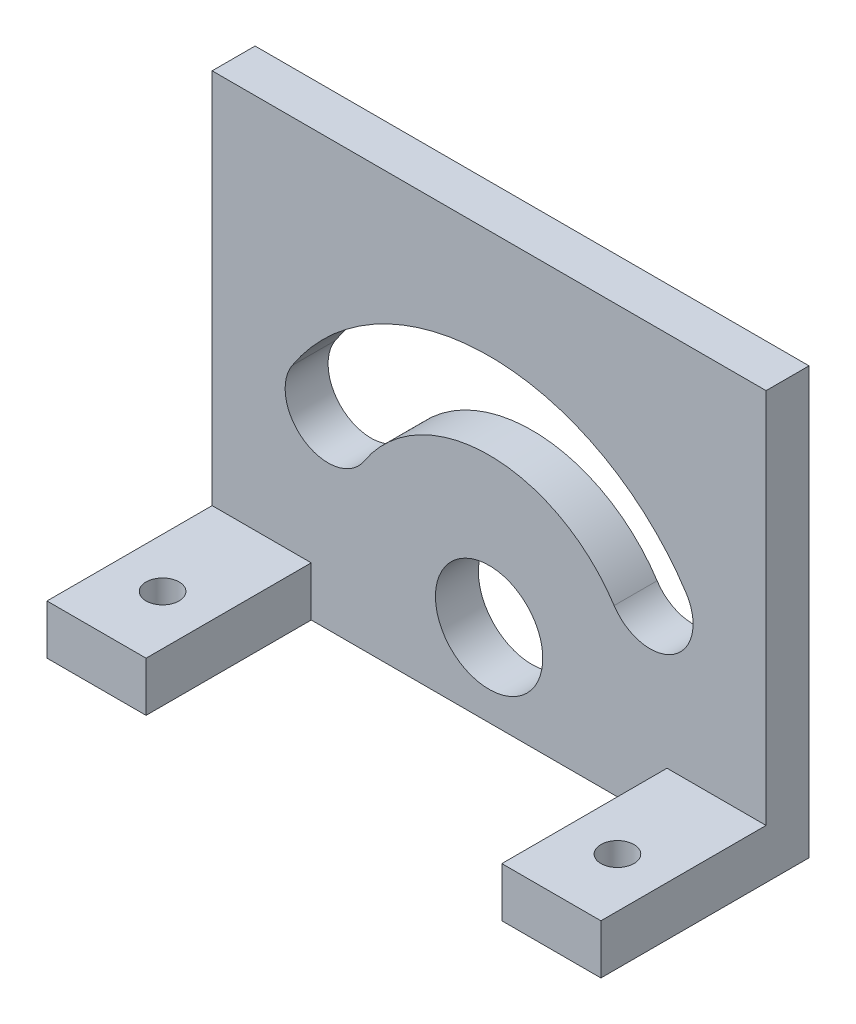
ISO-10303-21;
HEADER;
FILE_DESCRIPTION(('STEP AP214'),'2;1');
FILE_NAME('part.step','',(''),(''),'','','');
FILE_SCHEMA(('AUTOMOTIVE_DESIGN { 1 0 10303 214 1 1 1 1 }'));
ENDSEC;
DATA;
#1=APPLICATION_CONTEXT('core data for automotive mechanical design processes');
#2=APPLICATION_PROTOCOL_DEFINITION('international standard','automotive_design',2000,#1);
#3=PRODUCT_CONTEXT('',#1,'mechanical');
#4=PRODUCT('Part','Part','',(#3));
#5=PRODUCT_RELATED_PRODUCT_CATEGORY('part','',(#4));
#6=PRODUCT_DEFINITION_FORMATION('','',#4);
#7=PRODUCT_DEFINITION_CONTEXT('part definition',#1,'design');
#8=PRODUCT_DEFINITION('design','',#6,#7);
#9=PRODUCT_DEFINITION_SHAPE('','',#8);
#10=(LENGTH_UNIT() NAMED_UNIT(*) SI_UNIT(.MILLI.,.METRE.));
#11=(NAMED_UNIT(*) PLANE_ANGLE_UNIT() SI_UNIT($,.RADIAN.));
#12=(NAMED_UNIT(*) SI_UNIT($,.STERADIAN.) SOLID_ANGLE_UNIT());
#13=UNCERTAINTY_MEASURE_WITH_UNIT(LENGTH_MEASURE(1.E-05),#10,'distance_accuracy_value','');
#14=(GEOMETRIC_REPRESENTATION_CONTEXT(3) GLOBAL_UNCERTAINTY_ASSIGNED_CONTEXT((#13)) GLOBAL_UNIT_ASSIGNED_CONTEXT((#10,
#11,#12)) REPRESENTATION_CONTEXT('',''));
#15=CARTESIAN_POINT('',(0.,0.,0.));
#16=DIRECTION('',(0.,0.,1.));
#17=DIRECTION('',(1.,0.,0.));
#18=AXIS2_PLACEMENT_3D('',#15,#16,#17);
#19=CARTESIAN_POINT('',(-48.2570233696967,36.6757535053965,3.75));
#20=DIRECTION('',(0.,0.,1.));
#21=DIRECTION('',(1.,0.,0.));
#22=AXIS2_PLACEMENT_3D('',#19,#20,#21);
#23=PLANE('',#22);
#24=DIRECTION('',(0.,-1.,0.));
#25=VECTOR('',#24,1.);
#26=CARTESIAN_POINT('',(51.7929766303033,-20.3242464946035,3.75));
#27=LINE('',#26,#25);
#28=CARTESIAN_POINT('',(51.7929766303033,-20.3242464946035,3.75));
#29=VERTEX_POINT('',#28);
#30=CARTESIAN_POINT('',(51.7929766303033,-27.8242464946035,3.75000000000001));
#31=VERTEX_POINT('',#30);
#32=EDGE_CURVE('E50',#29,#31,#27,.T.);
#33=ORIENTED_EDGE('',*,*,#32,.F.);
#34=DIRECTION('',(1.,0.,0.));
#35=VECTOR('',#34,1.);
#36=CARTESIAN_POINT('',(66.7929766303033,-20.3242464946035,3.75000000000001));
#37=LINE('',#36,#35);
#38=CARTESIAN_POINT('',(66.7929766303033,-20.3242464946035,3.75));
#39=VERTEX_POINT('',#38);
#40=EDGE_CURVE('E55',#29,#39,#37,.T.);
#41=ORIENTED_EDGE('',*,*,#40,.T.);
#42=DIRECTION('',(0.,1.,0.));
#43=VECTOR('',#42,1.);
#44=CARTESIAN_POINT('',(66.7929766303033,36.6757535053965,3.75));
#45=LINE('',#44,#43);
#46=CARTESIAN_POINT('',(66.7929766303033,36.6757535053965,3.75));
#47=VERTEX_POINT('',#46);
#48=EDGE_CURVE('E155',#39,#47,#45,.T.);
#49=ORIENTED_EDGE('',*,*,#48,.T.);
#50=DIRECTION('',(-1.,0.,0.));
#51=VECTOR('',#50,1.);
#52=CARTESIAN_POINT('',(37.7054766303033,36.6757535053965,3.75));
#53=LINE('',#52,#51);
#54=CARTESIAN_POINT('',(-17.0570233696967,36.6757535053965,3.75000000000001));
#55=VERTEX_POINT('',#54);
#56=EDGE_CURVE('E245',#47,#55,#53,.T.);
#57=ORIENTED_EDGE('',*,*,#56,.T.);
#58=DIRECTION('',(0.,-1.,0.));
#59=VECTOR('',#58,1.);
#60=CARTESIAN_POINT('',(-17.0570233696967,36.6757535053965,3.75000000000001));
#61=LINE('',#60,#59);
#62=CARTESIAN_POINT('',(-17.0570233696967,-20.3242464946035,3.75000000000001));
#63=VERTEX_POINT('',#62);
#64=EDGE_CURVE('E192',#55,#63,#61,.T.);
#65=ORIENTED_EDGE('',*,*,#64,.T.);
#66=DIRECTION('',(1.,0.,0.));
#67=VECTOR('',#66,1.);
#68=CARTESIAN_POINT('',(-17.0570233696967,-20.3242464946035,3.75000000000001));
#69=LINE('',#68,#67);
#70=CARTESIAN_POINT('',(-2.05702336969668,-20.3242464946035,3.75000000000001));
#71=VERTEX_POINT('',#70);
#72=EDGE_CURVE('E174',#63,#71,#69,.T.);
#73=ORIENTED_EDGE('',*,*,#72,.T.);
#74=DIRECTION('',(0.,-1.,0.));
#75=VECTOR('',#74,1.);
#76=CARTESIAN_POINT('',(-2.05702336969668,-20.3242464946035,3.75000000000001));
#77=LINE('',#76,#75);
#78=CARTESIAN_POINT('',(-2.05702336969668,-27.8242464946035,3.75000000000001));
#79=VERTEX_POINT('',#78);
#80=EDGE_CURVE('E184',#71,#79,#77,.T.);
#81=ORIENTED_EDGE('',*,*,#80,.T.);
#82=DIRECTION('',(1.,0.,0.));
#83=VECTOR('',#82,1.);
#84=CARTESIAN_POINT('',(66.7929766303033,-27.8242464946035,3.75000000000001));
#85=LINE('',#84,#83);
#86=EDGE_CURVE('E199',#79,#31,#85,.T.);
#87=ORIENTED_EDGE('',*,*,#86,.T.);
#88=EDGE_LOOP('',(#33,#41,#49,#57,#65,#73,#81,#87));
#89=FACE_BOUND('',#88,.T.);
#90=CARTESIAN_POINT('',(49.2429766303033,0.548435422766312,3.75));
#91=DIRECTION('',(0.,0.,1.));
#92=DIRECTION('',(1.,0.,0.));
#93=AXIS2_PLACEMENT_3D('',#90,#91,#92);
#94=CIRCLE('',#93,6.50000000000001);
#95=CARTESIAN_POINT('',(43.7960492560016,-2.99853260346159,3.75000000000001));
#96=VERTEX_POINT('',#95);
#97=CARTESIAN_POINT('',(54.689904004605,4.09540344899422,3.75000000000001));
#98=VERTEX_POINT('',#97);
#99=EDGE_CURVE('E235',#96,#98,#94,.T.);
#100=ORIENTED_EDGE('',*,*,#99,.F.);
#101=CARTESIAN_POINT('',(24.8679766303033,-15.3242464946035,3.75));
#102=DIRECTION('',(0.,0.,1.));
#103=DIRECTION('',(1.,0.,0.));
#104=AXIS2_PLACEMENT_3D('',#101,#102,#103);
#105=CIRCLE('',#104,22.5875);
#106=CARTESIAN_POINT('',(5.93990400460499,-2.99853260346159,3.75));
#107=VERTEX_POINT('',#106);
#108=EDGE_CURVE('E222',#107,#96,#105,.F.);
#109=ORIENTED_EDGE('',*,*,#108,.F.);
#110=CARTESIAN_POINT('',(0.492976630303313,0.548435422766312,3.75));
#111=DIRECTION('',(0.,0.,1.));
#112=DIRECTION('',(1.,0.,0.));
#113=AXIS2_PLACEMENT_3D('',#110,#111,#112);
#114=CIRCLE('',#113,6.5);
#115=CARTESIAN_POINT('',(-4.95395074399836,4.09540344899421,3.75000000000001));
#116=VERTEX_POINT('',#115);
#117=EDGE_CURVE('E230',#116,#107,#114,.T.);
#118=ORIENTED_EDGE('',*,*,#117,.F.);
#119=CARTESIAN_POINT('',(24.8679766303033,-15.3242464946035,3.75));
#120=DIRECTION('',(0.,0.,1.));
#121=DIRECTION('',(1.,0.,0.));
#122=AXIS2_PLACEMENT_3D('',#119,#120,#121);
#123=CIRCLE('',#122,35.5875);
#124=EDGE_CURVE('E233',#98,#116,#123,.T.);
#125=ORIENTED_EDGE('',*,*,#124,.F.);
#126=EDGE_LOOP('',(#100,#109,#118,#125));
#127=FACE_BOUND('',#126,.T.);
#128=CARTESIAN_POINT('',(24.8679766303033,-15.3242464946035,3.75));
#129=DIRECTION('',(0.,0.,1.));
#130=DIRECTION('',(1.,0.,0.));
#131=AXIS2_PLACEMENT_3D('',#128,#129,#130);
#132=CIRCLE('',#131,8.125);
#133=CARTESIAN_POINT('',(16.7429766303033,-15.3242464946035,3.75));
#134=VERTEX_POINT('',#133);
#135=EDGE_CURVE('E240',#134,#134,#132,.T.);
#136=ORIENTED_EDGE('',*,*,#135,.F.);
#137=EDGE_LOOP('',(#136));
#138=FACE_BOUND('',#137,.T.);
#139=ADVANCED_FACE('F35',(#89,#127,#138),#23,.T.);
#140=CARTESIAN_POINT('',(66.7929766303033,36.6757535053965,3.75));
#141=DIRECTION('',(-1.,0.,0.));
#142=DIRECTION('',(0.,0.,1.));
#143=AXIS2_PLACEMENT_3D('',#140,#141,#142);
#144=PLANE('',#143);
#145=ORIENTED_EDGE('',*,*,#48,.F.);
#146=DIRECTION('',(0.,0.,1.));
#147=VECTOR('',#146,1.);
#148=CARTESIAN_POINT('',(66.7929766303033,-20.3242464946035,3.75000000000001));
#149=LINE('',#148,#147);
#150=CARTESIAN_POINT('',(66.7929766303033,-20.3242464946035,28.75));
#151=VERTEX_POINT('',#150);
#152=EDGE_CURVE('E151',#39,#151,#149,.T.);
#153=ORIENTED_EDGE('',*,*,#152,.T.);
#154=DIRECTION('',(0.,-1.,0.));
#155=VECTOR('',#154,1.);
#156=CARTESIAN_POINT('',(66.7929766303033,-20.3242464946035,28.75));
#157=LINE('',#156,#155);
#158=CARTESIAN_POINT('',(66.7929766303033,-27.8242464946035,28.75));
#159=VERTEX_POINT('',#158);
#160=EDGE_CURVE('E136',#151,#159,#157,.T.);
#161=ORIENTED_EDGE('',*,*,#160,.T.);
#162=DIRECTION('',(0.,0.,-1.));
#163=VECTOR('',#162,1.);
#164=CARTESIAN_POINT('',(66.7929766303033,-27.8242464946035,3.75000000000001));
#165=LINE('',#164,#163);
#166=CARTESIAN_POINT('',(66.7929766303033,-27.8242464946035,-2.75));
#167=VERTEX_POINT('',#166);
#168=EDGE_CURVE('E202',#159,#167,#165,.T.);
#169=ORIENTED_EDGE('',*,*,#168,.T.);
#170=DIRECTION('',(0.,1.,0.));
#171=VECTOR('',#170,1.);
#172=CARTESIAN_POINT('',(66.7929766303033,36.6757535053965,-2.75));
#173=LINE('',#172,#171);
#174=CARTESIAN_POINT('',(66.7929766303033,36.6757535053965,-2.75));
#175=VERTEX_POINT('',#174);
#176=EDGE_CURVE('E243',#167,#175,#173,.T.);
#177=ORIENTED_EDGE('',*,*,#176,.T.);
#178=DIRECTION('',(0.,0.,-1.));
#179=VECTOR('',#178,1.);
#180=CARTESIAN_POINT('',(66.7929766303033,36.6757535053965,3.75));
#181=LINE('',#180,#179);
#182=EDGE_CURVE('E249',#47,#175,#181,.T.);
#183=ORIENTED_EDGE('',*,*,#182,.F.);
#184=EDGE_LOOP('',(#145,#153,#161,#169,#177,#183));
#185=FACE_BOUND('',#184,.T.);
#186=ADVANCED_FACE('F37',(#185),#144,.F.);
#187=CARTESIAN_POINT('',(-48.2570233696967,36.6757535053965,3.75));
#188=DIRECTION('',(0.,-1.,0.));
#189=DIRECTION('',(0.,0.,-1.));
#190=AXIS2_PLACEMENT_3D('',#187,#188,#189);
#191=PLANE('',#190);
#192=DIRECTION('',(-1.,0.,0.));
#193=VECTOR('',#192,1.);
#194=CARTESIAN_POINT('',(-48.2570233696967,36.6757535053965,-2.75));
#195=LINE('',#194,#193);
#196=CARTESIAN_POINT('',(-17.0570233696967,36.6757535053965,-2.75));
#197=VERTEX_POINT('',#196);
#198=EDGE_CURVE('E246',#175,#197,#195,.T.);
#199=ORIENTED_EDGE('',*,*,#198,.T.);
#200=DIRECTION('',(0.,0.,-1.));
#201=VECTOR('',#200,1.);
#202=CARTESIAN_POINT('',(-17.0570233696967,36.6757535053965,3.75000000000001));
#203=LINE('',#202,#201);
#204=EDGE_CURVE('E201',#55,#197,#203,.T.);
#205=ORIENTED_EDGE('',*,*,#204,.F.);
#206=ORIENTED_EDGE('',*,*,#56,.F.);
#207=ORIENTED_EDGE('',*,*,#182,.T.);
#208=EDGE_LOOP('',(#199,#205,#206,#207));
#209=FACE_BOUND('',#208,.T.);
#210=ADVANCED_FACE('F262',(#209),#191,.F.);
#211=CARTESIAN_POINT('',(-48.2570233696967,36.6757535053965,-2.75));
#212=DIRECTION('',(0.,0.,1.));
#213=DIRECTION('',(1.,0.,0.));
#214=AXIS2_PLACEMENT_3D('',#211,#212,#213);
#215=PLANE('',#214);
#216=CARTESIAN_POINT('',(24.8679766303033,-15.3242464946035,-2.75));
#217=DIRECTION('',(0.,0.,1.));
#218=DIRECTION('',(-1.,0.,0.));
#219=AXIS2_PLACEMENT_3D('',#216,#217,#218);
#220=CIRCLE('',#219,22.5875);
#221=CARTESIAN_POINT('',(43.7960492560016,-2.99853260346159,-2.75));
#222=VERTEX_POINT('',#221);
#223=CARTESIAN_POINT('',(5.93990400460499,-2.99853260346159,-2.75));
#224=VERTEX_POINT('',#223);
#225=EDGE_CURVE('E210',#222,#224,#220,.T.);
#226=ORIENTED_EDGE('',*,*,#225,.F.);
#227=CARTESIAN_POINT('',(49.2429766303033,0.548435422766312,-2.75));
#228=DIRECTION('',(0.,0.,-1.));
#229=DIRECTION('',(-1.,0.,0.));
#230=AXIS2_PLACEMENT_3D('',#227,#228,#229);
#231=CIRCLE('',#230,6.50000000000001);
#232=CARTESIAN_POINT('',(54.689904004605,4.09540344899422,-2.75));
#233=VERTEX_POINT('',#232);
#234=EDGE_CURVE('E204',#233,#222,#231,.T.);
#235=ORIENTED_EDGE('',*,*,#234,.F.);
#236=CARTESIAN_POINT('',(24.8679766303033,-15.3242464946035,-2.75));
#237=DIRECTION('',(0.,0.,-1.));
#238=DIRECTION('',(-1.,0.,0.));
#239=AXIS2_PLACEMENT_3D('',#236,#237,#238);
#240=CIRCLE('',#239,35.5875);
#241=CARTESIAN_POINT('',(-4.95395074399836,4.09540344899421,-2.75));
#242=VERTEX_POINT('',#241);
#243=EDGE_CURVE('E216',#242,#233,#240,.T.);
#244=ORIENTED_EDGE('',*,*,#243,.F.);
#245=CARTESIAN_POINT('',(0.492976630303313,0.548435422766312,-2.75));
#246=DIRECTION('',(0.,0.,-1.));
#247=DIRECTION('',(-1.,0.,0.));
#248=AXIS2_PLACEMENT_3D('',#245,#246,#247);
#249=CIRCLE('',#248,6.5);
#250=EDGE_CURVE('E213',#224,#242,#249,.T.);
#251=ORIENTED_EDGE('',*,*,#250,.F.);
#252=EDGE_LOOP('',(#226,#235,#244,#251));
#253=FACE_BOUND('',#252,.T.);
#254=CARTESIAN_POINT('',(24.8679766303033,-15.3242464946035,-2.75));
#255=DIRECTION('',(0.,0.,-1.));
#256=DIRECTION('',(-1.,0.,0.));
#257=AXIS2_PLACEMENT_3D('',#254,#255,#256);
#258=CIRCLE('',#257,8.125);
#259=CARTESIAN_POINT('',(16.7429766303033,-15.3242464946035,-2.75));
#260=VERTEX_POINT('',#259);
#261=EDGE_CURVE('E237',#260,#260,#258,.T.);
#262=ORIENTED_EDGE('',*,*,#261,.F.);
#263=EDGE_LOOP('',(#262));
#264=FACE_BOUND('',#263,.T.);
#265=ORIENTED_EDGE('',*,*,#176,.F.);
#266=DIRECTION('',(-1.,0.,0.));
#267=VECTOR('',#266,1.);
#268=CARTESIAN_POINT('',(-48.2570233696967,-27.8242464946035,-2.75));
#269=LINE('',#268,#267);
#270=CARTESIAN_POINT('',(-17.0570233696967,-27.8242464946035,-2.75));
#271=VERTEX_POINT('',#270);
#272=EDGE_CURVE('E11',#167,#271,#269,.T.);
#273=ORIENTED_EDGE('',*,*,#272,.T.);
#274=DIRECTION('',(0.,1.,0.));
#275=VECTOR('',#274,1.);
#276=CARTESIAN_POINT('',(-17.0570233696967,36.6757535053965,-2.75));
#277=LINE('',#276,#275);
#278=EDGE_CURVE('E43',#271,#197,#277,.T.);
#279=ORIENTED_EDGE('',*,*,#278,.T.);
#280=ORIENTED_EDGE('',*,*,#198,.F.);
#281=EDGE_LOOP('',(#265,#273,#279,#280));
#282=FACE_BOUND('',#281,.T.);
#283=ADVANCED_FACE('F258',(#253,#264,#282),#215,.F.);
#284=CARTESIAN_POINT('',(24.8679766303033,-15.3242464946035,19.675));
#285=DIRECTION('',(0.,0.,-1.));
#286=DIRECTION('',(-1.,0.,0.));
#287=AXIS2_PLACEMENT_3D('',#284,#285,#286);
#288=CYLINDRICAL_SURFACE('',#287,8.125);
#289=CARTESIAN_POINT('',(16.7429766303033,-15.3242464946035,3.75));
#290=CARTESIAN_POINT('',(16.7429766303033,-15.3242464946035,3.68229166666667));
#291=CARTESIAN_POINT('',(16.7429766303033,-15.3242464946035,3.61458333333334));
#292=CARTESIAN_POINT('',(16.7429766303033,-15.3242464946035,3.47916666666667));
#293=CARTESIAN_POINT('',(16.7429766303033,-15.3242464946035,3.41145833333334));
#294=CARTESIAN_POINT('',(16.7429766303033,-15.3242464946035,3.27604166666667));
#295=CARTESIAN_POINT('',(16.7429766303033,-15.3242464946035,3.20833333333334));
#296=CARTESIAN_POINT('',(16.7429766303033,-15.3242464946035,3.07291666666667));
#297=CARTESIAN_POINT('',(16.7429766303033,-15.3242464946035,3.00520833333334));
#298=CARTESIAN_POINT('',(16.7429766303033,-15.3242464946035,2.86979166666667));
#299=CARTESIAN_POINT('',(16.7429766303033,-15.3242464946035,2.80208333333334));
#300=CARTESIAN_POINT('',(16.7429766303033,-15.3242464946035,2.66666666666667));
#301=CARTESIAN_POINT('',(16.7429766303033,-15.3242464946035,2.59895833333334));
#302=CARTESIAN_POINT('',(16.7429766303033,-15.3242464946035,2.46354166666667));
#303=CARTESIAN_POINT('',(16.7429766303033,-15.3242464946035,2.39583333333333));
#304=CARTESIAN_POINT('',(16.7429766303033,-15.3242464946035,2.26041666666667));
#305=CARTESIAN_POINT('',(16.7429766303033,-15.3242464946035,2.19270833333333));
#306=CARTESIAN_POINT('',(16.7429766303033,-15.3242464946035,2.05729166666667));
#307=CARTESIAN_POINT('',(16.7429766303033,-15.3242464946035,1.98958333333334));
#308=CARTESIAN_POINT('',(16.7429766303033,-15.3242464946035,1.85416666666667));
#309=CARTESIAN_POINT('',(16.7429766303033,-15.3242464946035,1.78645833333334));
#310=CARTESIAN_POINT('',(16.7429766303033,-15.3242464946035,1.65104166666667));
#311=CARTESIAN_POINT('',(16.7429766303033,-15.3242464946035,1.58333333333333));
#312=CARTESIAN_POINT('',(16.7429766303033,-15.3242464946035,1.44791666666667));
#313=CARTESIAN_POINT('',(16.7429766303033,-15.3242464946035,1.38020833333333));
#314=CARTESIAN_POINT('',(16.7429766303033,-15.3242464946035,1.24479166666667));
#315=CARTESIAN_POINT('',(16.7429766303033,-15.3242464946035,1.17708333333334));
#316=CARTESIAN_POINT('',(16.7429766303033,-15.3242464946035,1.04166666666667));
#317=CARTESIAN_POINT('',(16.7429766303033,-15.3242464946035,0.973958333333335));
#318=CARTESIAN_POINT('',(16.7429766303033,-15.3242464946035,0.838541666666667));
#319=CARTESIAN_POINT('',(16.7429766303033,-15.3242464946035,0.770833333333333));
#320=CARTESIAN_POINT('',(16.7429766303033,-15.3242464946035,0.635416666666666));
#321=CARTESIAN_POINT('',(16.7429766303033,-15.3242464946035,0.567708333333333));
#322=CARTESIAN_POINT('',(16.7429766303033,-15.3242464946035,0.432291666666668));
#323=CARTESIAN_POINT('',(16.7429766303033,-15.3242464946035,0.364583333333335));
#324=CARTESIAN_POINT('',(16.7429766303033,-15.3242464946035,0.229166666666668));
#325=CARTESIAN_POINT('',(16.7429766303033,-15.3242464946035,0.161458333333334));
#326=CARTESIAN_POINT('',(16.7429766303033,-15.3242464946035,0.0260416666666661));
#327=CARTESIAN_POINT('',(16.7429766303033,-15.3242464946035,-0.0416666666666679));
#328=CARTESIAN_POINT('',(16.7429766303033,-15.3242464946035,-0.177083333333335));
#329=CARTESIAN_POINT('',(16.7429766303033,-15.3242464946035,-0.244791666666667));
#330=CARTESIAN_POINT('',(16.7429766303033,-15.3242464946035,-0.380208333333333));
#331=CARTESIAN_POINT('',(16.7429766303033,-15.3242464946035,-0.447916666666666));
#332=CARTESIAN_POINT('',(16.7429766303033,-15.3242464946035,-0.583333333333333));
#333=CARTESIAN_POINT('',(16.7429766303033,-15.3242464946035,-0.651041666666667));
#334=CARTESIAN_POINT('',(16.7429766303033,-15.3242464946035,-0.786458333333335));
#335=CARTESIAN_POINT('',(16.7429766303033,-15.3242464946035,-0.854166666666669));
#336=CARTESIAN_POINT('',(16.7429766303033,-15.3242464946035,-0.989583333333335));
#337=CARTESIAN_POINT('',(16.7429766303033,-15.3242464946035,-1.05729166666667));
#338=CARTESIAN_POINT('',(16.7429766303033,-15.3242464946035,-1.19270833333333));
#339=CARTESIAN_POINT('',(16.7429766303033,-15.3242464946035,-1.26041666666667));
#340=CARTESIAN_POINT('',(16.7429766303033,-15.3242464946035,-1.39583333333333));
#341=CARTESIAN_POINT('',(16.7429766303033,-15.3242464946035,-1.46354166666667));
#342=CARTESIAN_POINT('',(16.7429766303033,-15.3242464946035,-1.59895833333334));
#343=CARTESIAN_POINT('',(16.7429766303033,-15.3242464946035,-1.66666666666667));
#344=CARTESIAN_POINT('',(16.7429766303033,-15.3242464946035,-1.80208333333334));
#345=CARTESIAN_POINT('',(16.7429766303033,-15.3242464946035,-1.86979166666667));
#346=CARTESIAN_POINT('',(16.7429766303033,-15.3242464946035,-2.00520833333333));
#347=CARTESIAN_POINT('',(16.7429766303033,-15.3242464946035,-2.07291666666667));
#348=CARTESIAN_POINT('',(16.7429766303033,-15.3242464946035,-2.20833333333333));
#349=CARTESIAN_POINT('',(16.7429766303033,-15.3242464946035,-2.27604166666667));
#350=CARTESIAN_POINT('',(16.7429766303033,-15.3242464946035,-2.41145833333334));
#351=CARTESIAN_POINT('',(16.7429766303033,-15.3242464946035,-2.47916666666667));
#352=CARTESIAN_POINT('',(16.7429766303033,-15.3242464946035,-2.61458333333334));
#353=CARTESIAN_POINT('',(16.7429766303033,-15.3242464946035,-2.68229166666667));
#354=CARTESIAN_POINT('',(16.7429766303033,-15.3242464946035,-2.75));
#355=B_SPLINE_CURVE_WITH_KNOTS('',3,(#289,#290,#291,#292,#293,#294,#295,#296,#297,#298,#299,
#300,#301,#302,#303,#304,#305,#306,#307,#308,#309,#310,#311,#312,#313,#314,#315,#316,#317,#318,
#319,#320,#321,#322,#323,#324,#325,#326,#327,#328,#329,#330,#331,#332,#333,#334,#335,#336,#337,
#338,#339,#340,#341,#342,#343,#344,#345,#346,#347,#348,#349,#350,#351,#352,#353,#354),
.UNSPECIFIED.,.F.,.F.,(4,2,2,2,2,2,2,2,2,2,2,2,2,2,2,2,2,2,2,2,2,2,2,2,2,2,2,2,2,2,2,2,4),(0.,
0.203124999999998,0.40625,0.609375000000002,0.812500000000001,1.015625,1.21875,1.421875,1.625,
1.828125,2.03125,2.234375,2.4375,2.640625,2.84375,3.046875,3.25,3.453125,3.65625,
3.85937500000001,4.0625,4.265625,4.46875,4.67187500000001,4.875,5.078125,5.28125,
5.48437500000001,5.68750000000001,5.890625,6.09375000000001,6.29687500000001,6.50000000000001),.UNSPECIFIED.);
#356=EDGE_CURVE('BSEAM301',#134,#260,#355,.T.);
#357=ORIENTED_EDGE('',*,*,#135,.T.);
#358=ORIENTED_EDGE('',*,*,#261,.T.);
#359=ORIENTED_EDGE('',*,*,#356,.T.);
#360=ORIENTED_EDGE('',*,*,#356,.F.);
#361=EDGE_LOOP('',(#357,#359,#358,#360));
#362=FACE_BOUND('',#361,.T.);
#363=ADVANCED_FACE('F301',(#362),#288,.F.);
#364=CARTESIAN_POINT('',(49.2429766303033,0.548435422766312,19.675));
#365=DIRECTION('',(0.,0.,-1.));
#366=DIRECTION('',(-1.,0.,0.));
#367=AXIS2_PLACEMENT_3D('',#364,#365,#366);
#368=CYLINDRICAL_SURFACE('',#367,6.50000000000001);
#369=ORIENTED_EDGE('',*,*,#99,.T.);
#370=DIRECTION('',(0.,0.,-1.));
#371=VECTOR('',#370,1.);
#372=CARTESIAN_POINT('',(54.689904004605,4.09540344899422,19.675));
#373=LINE('',#372,#371);
#374=EDGE_CURVE('E220',#98,#233,#373,.T.);
#375=ORIENTED_EDGE('',*,*,#374,.T.);
#376=ORIENTED_EDGE('',*,*,#234,.T.);
#377=DIRECTION('',(0.,0.,-1.));
#378=VECTOR('',#377,1.);
#379=CARTESIAN_POINT('',(43.7960492560016,-2.99853260346159,19.675));
#380=LINE('',#379,#378);
#381=EDGE_CURVE('E219',#96,#222,#380,.T.);
#382=ORIENTED_EDGE('',*,*,#381,.F.);
#383=EDGE_LOOP('',(#369,#375,#376,#382));
#384=FACE_BOUND('',#383,.T.);
#385=ADVANCED_FACE('F318',(#384),#368,.F.);
#386=CARTESIAN_POINT('',(24.8679766303033,-15.3242464946035,19.675));
#387=DIRECTION('',(0.,0.,-1.));
#388=DIRECTION('',(-1.,0.,0.));
#389=AXIS2_PLACEMENT_3D('',#386,#387,#388);
#390=CYLINDRICAL_SURFACE('',#389,35.5875);
#391=ORIENTED_EDGE('',*,*,#124,.T.);
#392=DIRECTION('',(0.,0.,-1.));
#393=VECTOR('',#392,1.);
#394=CARTESIAN_POINT('',(-4.95395074399836,4.09540344899421,19.675));
#395=LINE('',#394,#393);
#396=EDGE_CURVE('E223',#116,#242,#395,.T.);
#397=ORIENTED_EDGE('',*,*,#396,.T.);
#398=ORIENTED_EDGE('',*,*,#243,.T.);
#399=ORIENTED_EDGE('',*,*,#374,.F.);
#400=EDGE_LOOP('',(#391,#397,#398,#399));
#401=FACE_BOUND('',#400,.T.);
#402=ADVANCED_FACE('F325',(#401),#390,.F.);
#403=CARTESIAN_POINT('',(0.492976630303313,0.548435422766312,19.675));
#404=DIRECTION('',(0.,0.,-1.));
#405=DIRECTION('',(-1.,0.,0.));
#406=AXIS2_PLACEMENT_3D('',#403,#404,#405);
#407=CYLINDRICAL_SURFACE('',#406,6.5);
#408=ORIENTED_EDGE('',*,*,#117,.T.);
#409=DIRECTION('',(0.,0.,-1.));
#410=VECTOR('',#409,1.);
#411=CARTESIAN_POINT('',(5.93990400460499,-2.99853260346159,19.675));
#412=LINE('',#411,#410);
#413=EDGE_CURVE('E225',#107,#224,#412,.T.);
#414=ORIENTED_EDGE('',*,*,#413,.T.);
#415=ORIENTED_EDGE('',*,*,#250,.T.);
#416=ORIENTED_EDGE('',*,*,#396,.F.);
#417=EDGE_LOOP('',(#408,#414,#415,#416));
#418=FACE_BOUND('',#417,.T.);
#419=ADVANCED_FACE('F332',(#418),#407,.F.);
#420=CARTESIAN_POINT('',(24.8679766303033,-15.3242464946035,19.675));
#421=DIRECTION('',(0.,0.,-1.));
#422=DIRECTION('',(-1.,0.,0.));
#423=AXIS2_PLACEMENT_3D('',#420,#421,#422);
#424=CYLINDRICAL_SURFACE('',#423,22.5875);
#425=ORIENTED_EDGE('',*,*,#108,.T.);
#426=ORIENTED_EDGE('',*,*,#381,.T.);
#427=ORIENTED_EDGE('',*,*,#225,.T.);
#428=ORIENTED_EDGE('',*,*,#413,.F.);
#429=EDGE_LOOP('',(#425,#426,#427,#428));
#430=FACE_BOUND('',#429,.T.);
#431=ADVANCED_FACE('F340',(#430),#424,.T.);
#432=CARTESIAN_POINT('',(66.7929766303033,-27.8242464946035,3.75000000000001));
#433=DIRECTION('',(0.,1.,0.));
#434=DIRECTION('',(-1.,0.,0.));
#435=AXIS2_PLACEMENT_3D('',#432,#433,#434);
#436=PLANE('',#435);
#437=CARTESIAN_POINT('',(-9.55702336969668,-27.8242464946035,18.75));
#438=DIRECTION('',(0.,1.,0.));
#439=DIRECTION('',(0.,0.,1.));
#440=AXIS2_PLACEMENT_3D('',#437,#438,#439);
#441=CIRCLE('',#440,2.5);
#442=CARTESIAN_POINT('',(-9.55702336969668,-27.8242464946035,21.25));
#443=VERTEX_POINT('',#442);
#444=EDGE_CURVE('E166',#443,#443,#441,.T.);
#445=ORIENTED_EDGE('',*,*,#444,.T.);
#446=EDGE_LOOP('',(#445));
#447=FACE_BOUND('',#446,.T.);
#448=CARTESIAN_POINT('',(59.2929766303034,-27.8242464946035,18.75));
#449=DIRECTION('',(0.,1.,0.));
#450=DIRECTION('',(0.,0.,-1.));
#451=AXIS2_PLACEMENT_3D('',#448,#449,#450);
#452=CIRCLE('',#451,2.5);
#453=CARTESIAN_POINT('',(59.2929766303034,-27.8242464946035,16.25));
#454=VERTEX_POINT('',#453);
#455=EDGE_CURVE('E426',#454,#454,#452,.T.);
#456=ORIENTED_EDGE('',*,*,#455,.T.);
#457=EDGE_LOOP('',(#456));
#458=FACE_BOUND('',#457,.T.);
#459=ORIENTED_EDGE('',*,*,#168,.F.);
#460=DIRECTION('',(-1.,0.,0.));
#461=VECTOR('',#460,1.);
#462=CARTESIAN_POINT('',(66.7929766303033,-27.8242464946035,28.75));
#463=LINE('',#462,#461);
#464=CARTESIAN_POINT('',(51.7929766303033,-27.8242464946035,28.75));
#465=VERTEX_POINT('',#464);
#466=EDGE_CURVE('E141',#159,#465,#463,.T.);
#467=ORIENTED_EDGE('',*,*,#466,.T.);
#468=DIRECTION('',(0.,0.,-1.));
#469=VECTOR('',#468,1.);
#470=CARTESIAN_POINT('',(51.7929766303033,-27.8242464946035,3.75));
#471=LINE('',#470,#469);
#472=EDGE_CURVE('E156',#465,#31,#471,.T.);
#473=ORIENTED_EDGE('',*,*,#472,.T.);
#474=ORIENTED_EDGE('',*,*,#86,.F.);
#475=DIRECTION('',(0.,0.,1.));
#476=VECTOR('',#475,1.);
#477=CARTESIAN_POINT('',(-2.05702336969668,-27.8242464946035,3.75000000000001));
#478=LINE('',#477,#476);
#479=CARTESIAN_POINT('',(-2.05702336969668,-27.8242464946035,28.75));
#480=VERTEX_POINT('',#479);
#481=EDGE_CURVE('E169',#79,#480,#478,.T.);
#482=ORIENTED_EDGE('',*,*,#481,.T.);
#483=DIRECTION('',(-1.,0.,0.));
#484=VECTOR('',#483,1.);
#485=CARTESIAN_POINT('',(-17.0570233696967,-27.8242464946035,28.75));
#486=LINE('',#485,#484);
#487=CARTESIAN_POINT('',(-17.0570233696967,-27.8242464946035,28.75));
#488=VERTEX_POINT('',#487);
#489=EDGE_CURVE('E175',#480,#488,#486,.T.);
#490=ORIENTED_EDGE('',*,*,#489,.T.);
#491=DIRECTION('',(0.,0.,-1.));
#492=VECTOR('',#491,1.);
#493=CARTESIAN_POINT('',(-17.0570233696967,-27.8242464946035,3.75000000000001));
#494=LINE('',#493,#492);
#495=EDGE_CURVE('E205',#488,#271,#494,.T.);
#496=ORIENTED_EDGE('',*,*,#495,.T.);
#497=ORIENTED_EDGE('',*,*,#272,.F.);
#498=EDGE_LOOP('',(#459,#467,#473,#474,#482,#490,#496,#497));
#499=FACE_BOUND('',#498,.T.);
#500=ADVANCED_FACE('F265',(#447,#458,#499),#436,.F.);
#501=CARTESIAN_POINT('',(-17.0570233696967,36.6757535053965,3.75000000000001));
#502=DIRECTION('',(1.,0.,0.));
#503=DIRECTION('',(0.,1.,0.));
#504=AXIS2_PLACEMENT_3D('',#501,#502,#503);
#505=PLANE('',#504);
#506=ORIENTED_EDGE('',*,*,#495,.F.);
#507=DIRECTION('',(0.,-1.,0.));
#508=VECTOR('',#507,1.);
#509=CARTESIAN_POINT('',(-17.0570233696967,-20.3242464946035,28.75));
#510=LINE('',#509,#508);
#511=CARTESIAN_POINT('',(-17.0570233696967,-20.3242464946035,28.75));
#512=VERTEX_POINT('',#511);
#513=EDGE_CURVE('E189',#512,#488,#510,.T.);
#514=ORIENTED_EDGE('',*,*,#513,.F.);
#515=DIRECTION('',(0.,0.,-1.));
#516=VECTOR('',#515,1.);
#517=CARTESIAN_POINT('',(-17.0570233696967,-20.3242464946035,3.75000000000001));
#518=LINE('',#517,#516);
#519=EDGE_CURVE('E171',#512,#63,#518,.T.);
#520=ORIENTED_EDGE('',*,*,#519,.T.);
#521=ORIENTED_EDGE('',*,*,#64,.F.);
#522=ORIENTED_EDGE('',*,*,#204,.T.);
#523=ORIENTED_EDGE('',*,*,#278,.F.);
#524=EDGE_LOOP('',(#506,#514,#520,#521,#522,#523));
#525=FACE_BOUND('',#524,.T.);
#526=ADVANCED_FACE('F267',(#525),#505,.F.);
#527=CARTESIAN_POINT('',(-17.0570233696967,-20.3242464946035,28.75));
#528=DIRECTION('',(0.,0.,1.));
#529=DIRECTION('',(1.,0.,0.));
#530=AXIS2_PLACEMENT_3D('',#527,#528,#529);
#531=PLANE('',#530);
#532=ORIENTED_EDGE('',*,*,#489,.F.);
#533=DIRECTION('',(0.,-1.,0.));
#534=VECTOR('',#533,1.);
#535=CARTESIAN_POINT('',(-2.05702336969668,-20.3242464946035,28.75));
#536=LINE('',#535,#534);
#537=CARTESIAN_POINT('',(-2.05702336969668,-20.3242464946035,28.75));
#538=VERTEX_POINT('',#537);
#539=EDGE_CURVE('E193',#538,#480,#536,.T.);
#540=ORIENTED_EDGE('',*,*,#539,.F.);
#541=DIRECTION('',(-1.,0.,0.));
#542=VECTOR('',#541,1.);
#543=CARTESIAN_POINT('',(-17.0570233696967,-20.3242464946035,28.75));
#544=LINE('',#543,#542);
#545=EDGE_CURVE('E181',#538,#512,#544,.T.);
#546=ORIENTED_EDGE('',*,*,#545,.T.);
#547=ORIENTED_EDGE('',*,*,#513,.T.);
#548=EDGE_LOOP('',(#532,#540,#546,#547));
#549=FACE_BOUND('',#548,.T.);
#550=ADVANCED_FACE('F270',(#549),#531,.T.);
#551=CARTESIAN_POINT('',(-2.05702336969668,-20.3242464946035,3.75000000000001));
#552=DIRECTION('',(1.,0.,0.));
#553=DIRECTION('',(0.,1.,0.));
#554=AXIS2_PLACEMENT_3D('',#551,#552,#553);
#555=PLANE('',#554);
#556=ORIENTED_EDGE('',*,*,#481,.F.);
#557=ORIENTED_EDGE('',*,*,#80,.F.);
#558=DIRECTION('',(0.,0.,1.));
#559=VECTOR('',#558,1.);
#560=CARTESIAN_POINT('',(-2.05702336969668,-20.3242464946035,3.75000000000001));
#561=LINE('',#560,#559);
#562=EDGE_CURVE('E178',#71,#538,#561,.T.);
#563=ORIENTED_EDGE('',*,*,#562,.T.);
#564=ORIENTED_EDGE('',*,*,#539,.T.);
#565=EDGE_LOOP('',(#556,#557,#563,#564));
#566=FACE_BOUND('',#565,.T.);
#567=ADVANCED_FACE('F288',(#566),#555,.T.);
#568=CARTESIAN_POINT('',(0.,-20.3242464946035,0.));
#569=DIRECTION('',(0.,1.,0.));
#570=DIRECTION('',(0.,0.,1.));
#571=AXIS2_PLACEMENT_3D('',#568,#569,#570);
#572=PLANE('',#571);
#573=CARTESIAN_POINT('',(-9.55702336969668,-20.3242464946035,18.75));
#574=DIRECTION('',(0.,1.,0.));
#575=DIRECTION('',(0.,0.,1.));
#576=AXIS2_PLACEMENT_3D('',#573,#574,#575);
#577=CIRCLE('',#576,2.5);
#578=CARTESIAN_POINT('',(-9.55702336969668,-20.3242464946035,21.25));
#579=VERTEX_POINT('',#578);
#580=EDGE_CURVE('E425',#579,#579,#577,.T.);
#581=ORIENTED_EDGE('',*,*,#580,.F.);
#582=EDGE_LOOP('',(#581));
#583=FACE_BOUND('',#582,.T.);
#584=ORIENTED_EDGE('',*,*,#519,.F.);
#585=ORIENTED_EDGE('',*,*,#545,.F.);
#586=ORIENTED_EDGE('',*,*,#562,.F.);
#587=ORIENTED_EDGE('',*,*,#72,.F.);
#588=EDGE_LOOP('',(#584,#585,#586,#587));
#589=FACE_BOUND('',#588,.T.);
#590=ADVANCED_FACE('F274',(#583,#589),#572,.T.);
#591=CARTESIAN_POINT('',(51.7929766303033,-20.3242464946035,3.75));
#592=DIRECTION('',(-1.,0.,0.));
#593=DIRECTION('',(0.,-1.,0.));
#594=AXIS2_PLACEMENT_3D('',#591,#592,#593);
#595=PLANE('',#594);
#596=ORIENTED_EDGE('',*,*,#472,.F.);
#597=DIRECTION('',(0.,-1.,0.));
#598=VECTOR('',#597,1.);
#599=CARTESIAN_POINT('',(51.7929766303033,-20.3242464946035,28.75));
#600=LINE('',#599,#598);
#601=CARTESIAN_POINT('',(51.7929766303033,-20.3242464946035,28.75));
#602=VERTEX_POINT('',#601);
#603=EDGE_CURVE('E145',#602,#465,#600,.T.);
#604=ORIENTED_EDGE('',*,*,#603,.F.);
#605=DIRECTION('',(0.,0.,-1.));
#606=VECTOR('',#605,1.);
#607=CARTESIAN_POINT('',(51.7929766303033,-20.3242464946035,3.75));
#608=LINE('',#607,#606);
#609=EDGE_CURVE('E152',#602,#29,#608,.T.);
#610=ORIENTED_EDGE('',*,*,#609,.T.);
#611=ORIENTED_EDGE('',*,*,#32,.T.);
#612=EDGE_LOOP('',(#596,#604,#610,#611));
#613=FACE_BOUND('',#612,.T.);
#614=ADVANCED_FACE('F280',(#613),#595,.T.);
#615=CARTESIAN_POINT('',(66.7929766303033,-20.3242464946035,28.75));
#616=DIRECTION('',(0.,0.,1.));
#617=DIRECTION('',(1.,0.,0.));
#618=AXIS2_PLACEMENT_3D('',#615,#616,#617);
#619=PLANE('',#618);
#620=ORIENTED_EDGE('',*,*,#466,.F.);
#621=ORIENTED_EDGE('',*,*,#160,.F.);
#622=DIRECTION('',(-1.,0.,0.));
#623=VECTOR('',#622,1.);
#624=CARTESIAN_POINT('',(66.7929766303033,-20.3242464946035,28.75));
#625=LINE('',#624,#623);
#626=EDGE_CURVE('E139',#151,#602,#625,.T.);
#627=ORIENTED_EDGE('',*,*,#626,.T.);
#628=ORIENTED_EDGE('',*,*,#603,.T.);
#629=EDGE_LOOP('',(#620,#621,#627,#628));
#630=FACE_BOUND('',#629,.T.);
#631=ADVANCED_FACE('F138',(#630),#619,.T.);
#632=CARTESIAN_POINT('',(0.,-20.3242464946035,0.));
#633=DIRECTION('',(0.,-1.,0.));
#634=DIRECTION('',(0.,0.,-1.));
#635=AXIS2_PLACEMENT_3D('',#632,#633,#634);
#636=PLANE('',#635);
#637=CARTESIAN_POINT('',(59.2929766303034,-20.3242464946035,18.75));
#638=DIRECTION('',(0.,1.,0.));
#639=DIRECTION('',(0.,0.,-1.));
#640=AXIS2_PLACEMENT_3D('',#637,#638,#639);
#641=CIRCLE('',#640,2.5);
#642=CARTESIAN_POINT('',(59.2929766303034,-20.3242464946035,16.25));
#643=VERTEX_POINT('',#642);
#644=EDGE_CURVE('E161',#643,#643,#641,.T.);
#645=ORIENTED_EDGE('',*,*,#644,.F.);
#646=EDGE_LOOP('',(#645));
#647=FACE_BOUND('',#646,.T.);
#648=ORIENTED_EDGE('',*,*,#152,.F.);
#649=ORIENTED_EDGE('',*,*,#40,.F.);
#650=ORIENTED_EDGE('',*,*,#609,.F.);
#651=ORIENTED_EDGE('',*,*,#626,.F.);
#652=EDGE_LOOP('',(#648,#649,#650,#651));
#653=FACE_BOUND('',#652,.T.);
#654=ADVANCED_FACE('F150',(#647,#653),#636,.F.);
#655=CARTESIAN_POINT('',(59.2929766303034,-27.8242464946035,18.75));
#656=DIRECTION('',(0.,1.,0.));
#657=DIRECTION('',(0.,0.,1.));
#658=AXIS2_PLACEMENT_3D('',#655,#656,#657);
#659=CYLINDRICAL_SURFACE('',#658,2.5);
#660=ORIENTED_EDGE('',*,*,#455,.F.);
#661=EDGE_LOOP('',(#660));
#662=FACE_BOUND('',#661,.T.);
#663=ORIENTED_EDGE('',*,*,#644,.T.);
#664=EDGE_LOOP('',(#663));
#665=FACE_BOUND('',#664,.T.);
#666=ADVANCED_FACE('F396',(#662,#665),#659,.F.);
#667=CARTESIAN_POINT('',(-9.55702336969668,-27.8242464946035,18.75));
#668=DIRECTION('',(0.,1.,0.));
#669=DIRECTION('',(0.,0.,1.));
#670=AXIS2_PLACEMENT_3D('',#667,#668,#669);
#671=CYLINDRICAL_SURFACE('',#670,2.5);
#672=ORIENTED_EDGE('',*,*,#444,.F.);
#673=EDGE_LOOP('',(#672));
#674=FACE_BOUND('',#673,.T.);
#675=ORIENTED_EDGE('',*,*,#580,.T.);
#676=EDGE_LOOP('',(#675));
#677=FACE_BOUND('',#676,.T.);
#678=ADVANCED_FACE('F406',(#674,#677),#671,.F.);
#679=CLOSED_SHELL('',(#139,#186,#210,#283,#363,#385,#402,#419,#431,#500,#526,#550,#567,#590,
#614,#631,#654,#666,#678));
#680=MANIFOLD_SOLID_BREP('B2',#679);
#681=ADVANCED_BREP_SHAPE_REPRESENTATION('',(#18,#680),#14);
#682=SHAPE_DEFINITION_REPRESENTATION(#9,#681);
ENDSEC;
END-ISO-10303-21;
